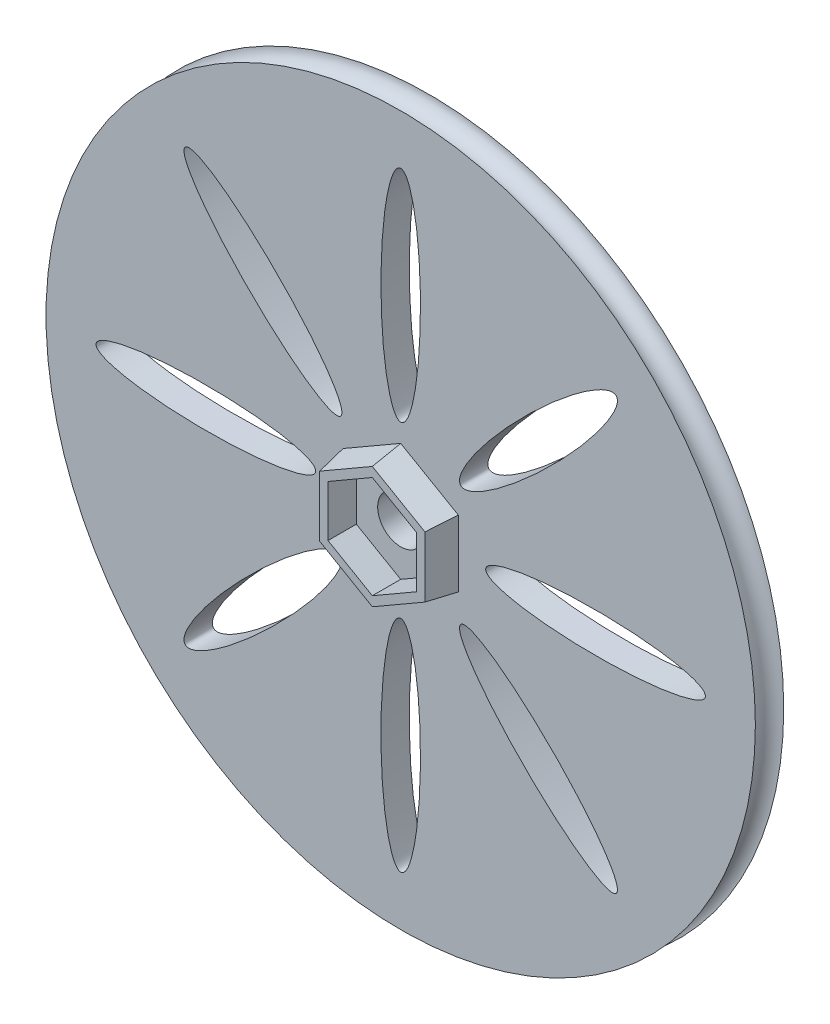
ISO-10303-21;
HEADER;
FILE_DESCRIPTION(('STEP AP214'),'2;1');
FILE_NAME('part.step','',(''),(''),'','','');
FILE_SCHEMA(('AUTOMOTIVE_DESIGN { 1 0 10303 214 1 1 1 1 }'));
ENDSEC;
DATA;
#1=APPLICATION_CONTEXT('core data for automotive mechanical design processes');
#2=APPLICATION_PROTOCOL_DEFINITION('international standard','automotive_design',2000,#1);
#3=PRODUCT_CONTEXT('',#1,'mechanical');
#4=PRODUCT('Part','Part','',(#3));
#5=PRODUCT_RELATED_PRODUCT_CATEGORY('part','',(#4));
#6=PRODUCT_DEFINITION_FORMATION('','',#4);
#7=PRODUCT_DEFINITION_CONTEXT('part definition',#1,'design');
#8=PRODUCT_DEFINITION('design','',#6,#7);
#9=PRODUCT_DEFINITION_SHAPE('','',#8);
#10=(LENGTH_UNIT() NAMED_UNIT(*) SI_UNIT(.MILLI.,.METRE.));
#11=(NAMED_UNIT(*) PLANE_ANGLE_UNIT() SI_UNIT($,.RADIAN.));
#12=(NAMED_UNIT(*) SI_UNIT($,.STERADIAN.) SOLID_ANGLE_UNIT());
#13=UNCERTAINTY_MEASURE_WITH_UNIT(LENGTH_MEASURE(1.E-05),#10,'distance_accuracy_value','');
#14=(GEOMETRIC_REPRESENTATION_CONTEXT(3) GLOBAL_UNCERTAINTY_ASSIGNED_CONTEXT((#13)) GLOBAL_UNIT_ASSIGNED_CONTEXT((#10,
#11,#12)) REPRESENTATION_CONTEXT('',''));
#15=CARTESIAN_POINT('',(0.,0.,0.));
#16=DIRECTION('',(0.,0.,1.));
#17=DIRECTION('',(1.,0.,0.));
#18=AXIS2_PLACEMENT_3D('',#15,#16,#17);
#19=CARTESIAN_POINT('',(0.,0.,2.032));
#20=DIRECTION('',(0.,0.,1.));
#21=DIRECTION('',(1.,0.,0.));
#22=AXIS2_PLACEMENT_3D('',#19,#20,#21);
#23=PLANE('',#22);
#24=CARTESIAN_POINT('',(-19.7328625352146,19.7328625352151,2.032));
#25=DIRECTION('',(0.,0.,1.));
#26=DIRECTION('',(0.707106781186539,-0.707106781186556,0.));
#27=AXIS2_PLACEMENT_3D('',#24,#25,#26);
#28=ELLIPSE('',#27,15.7362752755809,2.83617180564721);
#29=CARTESIAN_POINT('',(-8.60563557723324,8.60563557723345,2.032));
#30=VERTEX_POINT('',#29);
#31=EDGE_CURVE('E332',#30,#30,#28,.T.);
#32=ORIENTED_EDGE('',*,*,#31,.F.);
#33=EDGE_LOOP('',(#32));
#34=FACE_BOUND('',#33,.T.);
#35=CARTESIAN_POINT('',(-27.9064818217448,2.92304881540161E-13,2.032));
#36=DIRECTION('',(0.,0.,1.));
#37=DIRECTION('',(1.,0.,0.));
#38=AXIS2_PLACEMENT_3D('',#35,#36,#37);
#39=ELLIPSE('',#38,15.7362752755809,2.83617180564721);
#40=CARTESIAN_POINT('',(-12.1702065461638,1.27476147137393E-13,2.032));
#41=VERTEX_POINT('',#40);
#42=EDGE_CURVE('E400',#41,#41,#39,.T.);
#43=ORIENTED_EDGE('',*,*,#42,.F.);
#44=EDGE_LOOP('',(#43));
#45=FACE_BOUND('',#44,.T.);
#46=CARTESIAN_POINT('',(-19.732862535215,-19.7328625352147,2.032));
#47=DIRECTION('',(0.,0.,1.));
#48=DIRECTION('',(0.707106781186554,0.707106781186541,0.));
#49=AXIS2_PLACEMENT_3D('',#46,#47,#48);
#50=ELLIPSE('',#49,15.7362752755809,2.83617180564721);
#51=CARTESIAN_POINT('',(-8.60563557723342,-8.60563557723327,2.032));
#52=VERTEX_POINT('',#51);
#53=EDGE_CURVE('E392',#52,#52,#50,.T.);
#54=ORIENTED_EDGE('',*,*,#53,.F.);
#55=EDGE_LOOP('',(#54));
#56=FACE_BOUND('',#55,.T.);
#57=CARTESIAN_POINT('',(-1.94869921026774E-13,-27.9064818217448,2.032));
#58=DIRECTION('',(0.,0.,1.));
#59=DIRECTION('',(0.,1.,0.));
#60=AXIS2_PLACEMENT_3D('',#57,#58,#59);
#61=ELLIPSE('',#60,15.7362752755809,2.83617180564721);
#62=CARTESIAN_POINT('',(0.,-12.1702065461638,2.032));
#63=VERTEX_POINT('',#62);
#64=EDGE_CURVE('E384',#63,#63,#61,.T.);
#65=ORIENTED_EDGE('',*,*,#64,.F.);
#66=EDGE_LOOP('',(#65));
#67=FACE_BOUND('',#66,.T.);
#68=CARTESIAN_POINT('',(19.7328625352147,-19.7328625352149,2.032));
#69=DIRECTION('',(0.,0.,1.));
#70=DIRECTION('',(-0.707106781186544,0.707106781186551,0.));
#71=AXIS2_PLACEMENT_3D('',#68,#69,#70);
#72=ELLIPSE('',#71,15.7362752755809,2.83617180564722);
#73=CARTESIAN_POINT('',(8.6056355772333,-8.60563557723339,2.032));
#74=VERTEX_POINT('',#73);
#75=EDGE_CURVE('E376',#74,#74,#72,.T.);
#76=ORIENTED_EDGE('',*,*,#75,.F.);
#77=EDGE_LOOP('',(#76));
#78=FACE_BOUND('',#77,.T.);
#79=CARTESIAN_POINT('',(27.9064818217448,0.,2.032));
#80=DIRECTION('',(0.,0.,1.));
#81=DIRECTION('',(-1.,0.,0.));
#82=AXIS2_PLACEMENT_3D('',#79,#80,#81);
#83=ELLIPSE('',#82,15.7362752755809,2.83617180564721);
#84=CARTESIAN_POINT('',(12.1702065461638,0.,2.032));
#85=VERTEX_POINT('',#84);
#86=EDGE_CURVE('E368',#85,#85,#83,.T.);
#87=ORIENTED_EDGE('',*,*,#86,.F.);
#88=EDGE_LOOP('',(#87));
#89=FACE_BOUND('',#88,.T.);
#90=CARTESIAN_POINT('',(19.7328625352149,19.7328625352148,2.032));
#91=DIRECTION('',(0.,0.,1.));
#92=DIRECTION('',(-0.707106781186549,-0.707106781186546,0.));
#93=AXIS2_PLACEMENT_3D('',#90,#91,#92);
#94=ELLIPSE('',#93,15.736275275581,2.83617180564722);
#95=CARTESIAN_POINT('',(8.60563557723336,8.60563557723333,2.032));
#96=VERTEX_POINT('',#95);
#97=EDGE_CURVE('E360',#96,#96,#94,.T.);
#98=ORIENTED_EDGE('',*,*,#97,.F.);
#99=EDGE_LOOP('',(#98));
#100=FACE_BOUND('',#99,.T.);
#101=CARTESIAN_POINT('',(0.,27.9064818217448,2.032));
#102=DIRECTION('',(0.,0.,1.));
#103=DIRECTION('',(0.,-1.,0.));
#104=AXIS2_PLACEMENT_3D('',#101,#102,#103);
#105=ELLIPSE('',#104,15.7362752755809,2.83617180564721);
#106=CARTESIAN_POINT('',(0.,12.1702065461638,2.032));
#107=VERTEX_POINT('',#106);
#108=EDGE_CURVE('E331',#107,#107,#105,.T.);
#109=ORIENTED_EDGE('',*,*,#108,.F.);
#110=EDGE_LOOP('',(#109));
#111=FACE_BOUND('',#110,.T.);
#112=CARTESIAN_POINT('',(0.,0.,2.032));
#113=DIRECTION('',(0.,0.,1.));
#114=DIRECTION('',(1.,0.,0.));
#115=AXIS2_PLACEMENT_3D('',#112,#113,#114);
#116=CIRCLE('',#115,50.8);
#117=CARTESIAN_POINT('',(50.8,0.,2.032));
#118=VERTEX_POINT('',#117);
#119=EDGE_CURVE('E48',#118,#118,#116,.T.);
#120=ORIENTED_EDGE('',*,*,#119,.T.);
#121=EDGE_LOOP('',(#120));
#122=FACE_BOUND('',#121,.T.);
#123=DIRECTION('',(0.866025403784438,-0.5,0.));
#124=VECTOR('',#123,1.);
#125=CARTESIAN_POINT('',(-8.255,-4.76602647216036,2.032));
#126=LINE('',#125,#124);
#127=CARTESIAN_POINT('',(-8.255,-4.76602647216036,2.032));
#128=VERTEX_POINT('',#127);
#129=CARTESIAN_POINT('',(0.,-9.53205294432072,2.032));
#130=VERTEX_POINT('',#129);
#131=EDGE_CURVE('E192',#128,#130,#126,.T.);
#132=ORIENTED_EDGE('',*,*,#131,.F.);
#133=DIRECTION('',(0.,-1.,0.));
#134=VECTOR('',#133,1.);
#135=CARTESIAN_POINT('',(-8.255,4.76602647216036,2.032));
#136=LINE('',#135,#134);
#137=CARTESIAN_POINT('',(-8.255,4.76602647216036,2.032));
#138=VERTEX_POINT('',#137);
#139=EDGE_CURVE('E187',#138,#128,#136,.T.);
#140=ORIENTED_EDGE('',*,*,#139,.F.);
#141=DIRECTION('',(-0.866025403784439,-0.5,0.));
#142=VECTOR('',#141,1.);
#143=CARTESIAN_POINT('',(0.,9.53205294432072,2.032));
#144=LINE('',#143,#142);
#145=CARTESIAN_POINT('',(0.,9.53205294432072,2.032));
#146=VERTEX_POINT('',#145);
#147=EDGE_CURVE('E204',#146,#138,#144,.T.);
#148=ORIENTED_EDGE('',*,*,#147,.F.);
#149=DIRECTION('',(-0.866025403784439,0.5,0.));
#150=VECTOR('',#149,1.);
#151=CARTESIAN_POINT('',(8.255,4.76602647216036,2.032));
#152=LINE('',#151,#150);
#153=CARTESIAN_POINT('',(8.255,4.76602647216036,2.032));
#154=VERTEX_POINT('',#153);
#155=EDGE_CURVE('E201',#154,#146,#152,.T.);
#156=ORIENTED_EDGE('',*,*,#155,.F.);
#157=DIRECTION('',(0.,1.,0.));
#158=VECTOR('',#157,1.);
#159=CARTESIAN_POINT('',(8.255,-4.76602647216036,2.032));
#160=LINE('',#159,#158);
#161=CARTESIAN_POINT('',(8.255,-4.76602647216036,2.032));
#162=VERTEX_POINT('',#161);
#163=EDGE_CURVE('E198',#162,#154,#160,.T.);
#164=ORIENTED_EDGE('',*,*,#163,.F.);
#165=DIRECTION('',(0.866025403784439,0.5,0.));
#166=VECTOR('',#165,1.);
#167=CARTESIAN_POINT('',(0.,-9.53205294432072,2.032));
#168=LINE('',#167,#166);
#169=EDGE_CURVE('E195',#130,#162,#168,.T.);
#170=ORIENTED_EDGE('',*,*,#169,.F.);
#171=EDGE_LOOP('',(#132,#140,#148,#156,#164,#170));
#172=FACE_BOUND('',#171,.T.);
#173=ADVANCED_FACE('F39',(#34,#45,#56,#67,#78,#89,#100,#111,#122,#172),#23,.T.);
#174=CARTESIAN_POINT('',(0.,0.,0.));
#175=DIRECTION('',(0.,0.,1.));
#176=DIRECTION('',(1.,0.,0.));
#177=AXIS2_PLACEMENT_3D('',#174,#175,#176);
#178=TOROIDAL_SURFACE('',#177,50.8,2.032);
#179=CARTESIAN_POINT('',(0.,0.,-2.032));
#180=DIRECTION('',(0.,0.,1.));
#181=DIRECTION('',(1.,0.,0.));
#182=AXIS2_PLACEMENT_3D('',#179,#180,#181);
#183=CIRCLE('',#182,50.8);
#184=CARTESIAN_POINT('',(50.8,0.,-2.032));
#185=VERTEX_POINT('',#184);
#186=EDGE_CURVE('E11',#185,#185,#183,.T.);
#187=ORIENTED_EDGE('',*,*,#186,.T.);
#188=EDGE_LOOP('',(#187));
#189=FACE_BOUND('',#188,.T.);
#190=ORIENTED_EDGE('',*,*,#119,.F.);
#191=EDGE_LOOP('',(#190));
#192=FACE_BOUND('',#191,.T.);
#193=ADVANCED_FACE('F252',(#189,#192),#178,.F.);
#194=CARTESIAN_POINT('',(0.,0.,-2.032));
#195=DIRECTION('',(0.,0.,1.));
#196=DIRECTION('',(1.,0.,0.));
#197=AXIS2_PLACEMENT_3D('',#194,#195,#196);
#198=PLANE('',#197);
#199=CARTESIAN_POINT('',(-19.7328625352146,19.7328625352151,-2.032));
#200=DIRECTION('',(0.,0.,1.));
#201=DIRECTION('',(0.707106781186539,-0.707106781186556,0.));
#202=AXIS2_PLACEMENT_3D('',#199,#200,#201);
#203=ELLIPSE('',#202,15.7362752755809,2.83617180564721);
#204=CARTESIAN_POINT('',(-8.60563557723324,8.60563557723345,-2.032));
#205=VERTEX_POINT('',#204);
#206=EDGE_CURVE('E404',#205,#205,#203,.T.);
#207=ORIENTED_EDGE('',*,*,#206,.T.);
#208=EDGE_LOOP('',(#207));
#209=FACE_BOUND('',#208,.T.);
#210=CARTESIAN_POINT('',(-27.9064818217448,2.92304881540161E-13,-2.032));
#211=DIRECTION('',(0.,0.,1.));
#212=DIRECTION('',(1.,0.,0.));
#213=AXIS2_PLACEMENT_3D('',#210,#211,#212);
#214=ELLIPSE('',#213,15.7362752755809,2.83617180564721);
#215=CARTESIAN_POINT('',(-12.1702065461638,1.27476147137393E-13,-2.032));
#216=VERTEX_POINT('',#215);
#217=EDGE_CURVE('E396',#216,#216,#214,.T.);
#218=ORIENTED_EDGE('',*,*,#217,.T.);
#219=EDGE_LOOP('',(#218));
#220=FACE_BOUND('',#219,.T.);
#221=CARTESIAN_POINT('',(-19.732862535215,-19.7328625352147,-2.032));
#222=DIRECTION('',(0.,0.,1.));
#223=DIRECTION('',(0.707106781186554,0.707106781186541,0.));
#224=AXIS2_PLACEMENT_3D('',#221,#222,#223);
#225=ELLIPSE('',#224,15.7362752755809,2.83617180564721);
#226=CARTESIAN_POINT('',(-8.60563557723342,-8.60563557723327,-2.032));
#227=VERTEX_POINT('',#226);
#228=EDGE_CURVE('E388',#227,#227,#225,.T.);
#229=ORIENTED_EDGE('',*,*,#228,.T.);
#230=EDGE_LOOP('',(#229));
#231=FACE_BOUND('',#230,.T.);
#232=CARTESIAN_POINT('',(-1.94869921026774E-13,-27.9064818217448,-2.032));
#233=DIRECTION('',(0.,0.,1.));
#234=DIRECTION('',(0.,1.,0.));
#235=AXIS2_PLACEMENT_3D('',#232,#233,#234);
#236=ELLIPSE('',#235,15.7362752755809,2.83617180564721);
#237=CARTESIAN_POINT('',(0.,-12.1702065461638,-2.032));
#238=VERTEX_POINT('',#237);
#239=EDGE_CURVE('E380',#238,#238,#236,.T.);
#240=ORIENTED_EDGE('',*,*,#239,.T.);
#241=EDGE_LOOP('',(#240));
#242=FACE_BOUND('',#241,.T.);
#243=CARTESIAN_POINT('',(19.7328625352147,-19.7328625352149,-2.032));
#244=DIRECTION('',(0.,0.,1.));
#245=DIRECTION('',(-0.707106781186544,0.707106781186551,0.));
#246=AXIS2_PLACEMENT_3D('',#243,#244,#245);
#247=ELLIPSE('',#246,15.7362752755809,2.83617180564722);
#248=CARTESIAN_POINT('',(8.6056355772333,-8.60563557723339,-2.032));
#249=VERTEX_POINT('',#248);
#250=EDGE_CURVE('E372',#249,#249,#247,.T.);
#251=ORIENTED_EDGE('',*,*,#250,.T.);
#252=EDGE_LOOP('',(#251));
#253=FACE_BOUND('',#252,.T.);
#254=CARTESIAN_POINT('',(27.9064818217448,0.,-2.032));
#255=DIRECTION('',(0.,0.,1.));
#256=DIRECTION('',(-1.,0.,0.));
#257=AXIS2_PLACEMENT_3D('',#254,#255,#256);
#258=ELLIPSE('',#257,15.7362752755809,2.83617180564721);
#259=CARTESIAN_POINT('',(12.1702065461638,0.,-2.032));
#260=VERTEX_POINT('',#259);
#261=EDGE_CURVE('E364',#260,#260,#258,.T.);
#262=ORIENTED_EDGE('',*,*,#261,.T.);
#263=EDGE_LOOP('',(#262));
#264=FACE_BOUND('',#263,.T.);
#265=CARTESIAN_POINT('',(19.7328625352149,19.7328625352148,-2.032));
#266=DIRECTION('',(0.,0.,1.));
#267=DIRECTION('',(-0.707106781186549,-0.707106781186546,0.));
#268=AXIS2_PLACEMENT_3D('',#265,#266,#267);
#269=ELLIPSE('',#268,15.736275275581,2.83617180564722);
#270=CARTESIAN_POINT('',(8.60563557723336,8.60563557723333,-2.032));
#271=VERTEX_POINT('',#270);
#272=EDGE_CURVE('E336',#271,#271,#269,.T.);
#273=ORIENTED_EDGE('',*,*,#272,.T.);
#274=EDGE_LOOP('',(#273));
#275=FACE_BOUND('',#274,.T.);
#276=CARTESIAN_POINT('',(0.,27.9064818217448,-2.032));
#277=DIRECTION('',(0.,0.,1.));
#278=DIRECTION('',(0.,-1.,0.));
#279=AXIS2_PLACEMENT_3D('',#276,#277,#278);
#280=ELLIPSE('',#279,15.7362752755809,2.83617180564721);
#281=CARTESIAN_POINT('',(0.,12.1702065461638,-2.032));
#282=VERTEX_POINT('',#281);
#283=EDGE_CURVE('E324',#282,#282,#280,.T.);
#284=ORIENTED_EDGE('',*,*,#283,.T.);
#285=EDGE_LOOP('',(#284));
#286=FACE_BOUND('',#285,.T.);
#287=CARTESIAN_POINT('',(0.,0.,-2.032));
#288=DIRECTION('',(0.,0.,1.));
#289=DIRECTION('',(1.,0.,0.));
#290=AXIS2_PLACEMENT_3D('',#287,#288,#289);
#291=CIRCLE('',#290,3.302);
#292=CARTESIAN_POINT('',(3.302,0.,-2.032));
#293=VERTEX_POINT('',#292);
#294=EDGE_CURVE('E340',#293,#293,#291,.F.);
#295=ORIENTED_EDGE('',*,*,#294,.F.);
#296=EDGE_LOOP('',(#295));
#297=FACE_BOUND('',#296,.T.);
#298=ORIENTED_EDGE('',*,*,#186,.F.);
#299=EDGE_LOOP('',(#298));
#300=FACE_BOUND('',#299,.T.);
#301=ADVANCED_FACE('F41',(#209,#220,#231,#242,#253,#264,#275,#286,#297,#300),#198,.F.);
#302=CARTESIAN_POINT('',(-8.255,4.76602647216036,2.032));
#303=DIRECTION('',(-0.984807753012208,0.,0.173648177666931));
#304=DIRECTION('',(0.173648177666931,0.,0.984807753012208));
#305=AXIS2_PLACEMENT_3D('',#302,#303,#304);
#306=PLANE('',#305);
#307=ORIENTED_EDGE('',*,*,#139,.T.);
#308=DIRECTION('',(-0.172782012866211,-0.0997557416394319,-0.979895488325091));
#309=VECTOR('',#308,1.);
#310=CARTESIAN_POINT('',(-8.255,-4.76602647216036,2.032));
#311=LINE('',#310,#309);
#312=CARTESIAN_POINT('',(-7.5384071504008,-4.3523013975449,6.096));
#313=VERTEX_POINT('',#312);
#314=EDGE_CURVE('E208',#313,#128,#311,.T.);
#315=ORIENTED_EDGE('',*,*,#314,.F.);
#316=DIRECTION('',(0.,1.,0.));
#317=VECTOR('',#316,1.);
#318=CARTESIAN_POINT('',(-7.5384071504008,4.76602647216036,6.096));
#319=LINE('',#318,#317);
#320=CARTESIAN_POINT('',(-7.5384071504008,4.3523013975449,6.096));
#321=VERTEX_POINT('',#320);
#322=EDGE_CURVE('E207',#321,#313,#319,.F.);
#323=ORIENTED_EDGE('',*,*,#322,.F.);
#324=DIRECTION('',(-0.17278201286621,0.099755741639432,-0.97989548832509));
#325=VECTOR('',#324,1.);
#326=CARTESIAN_POINT('',(-8.255,4.76602647216036,2.032));
#327=LINE('',#326,#325);
#328=EDGE_CURVE('E212',#321,#138,#327,.T.);
#329=ORIENTED_EDGE('',*,*,#328,.T.);
#330=EDGE_LOOP('',(#307,#315,#323,#329));
#331=FACE_BOUND('',#330,.T.);
#332=ADVANCED_FACE('F260',(#331),#306,.T.);
#333=CARTESIAN_POINT('',(-8.255,-4.76602647216036,2.032));
#334=DIRECTION('',(-0.492403876506104,-0.852868531952443,0.173648177666931));
#335=DIRECTION('',(0.866025403784439,-0.5,0.));
#336=AXIS2_PLACEMENT_3D('',#333,#334,#335);
#337=PLANE('',#336);
#338=ORIENTED_EDGE('',*,*,#131,.T.);
#339=DIRECTION('',(0.,-0.199511483278864,-0.97989548832509));
#340=VECTOR('',#339,1.);
#341=CARTESIAN_POINT('',(0.,-9.53205294432072,2.032));
#342=LINE('',#341,#340);
#343=CARTESIAN_POINT('',(0.,-8.7046027950898,6.096));
#344=VERTEX_POINT('',#343);
#345=EDGE_CURVE('E211',#344,#130,#342,.T.);
#346=ORIENTED_EDGE('',*,*,#345,.F.);
#347=DIRECTION('',(-0.866025403784439,0.5,0.));
#348=VECTOR('',#347,1.);
#349=CARTESIAN_POINT('',(-7.8967035752004,-4.14543886023717,6.096));
#350=LINE('',#349,#348);
#351=EDGE_CURVE('E233',#313,#344,#350,.F.);
#352=ORIENTED_EDGE('',*,*,#351,.F.);
#353=ORIENTED_EDGE('',*,*,#314,.T.);
#354=EDGE_LOOP('',(#338,#346,#352,#353));
#355=FACE_BOUND('',#354,.T.);
#356=ADVANCED_FACE('F264',(#355),#337,.T.);
#357=CARTESIAN_POINT('',(0.,-9.53205294432072,2.032));
#358=DIRECTION('',(0.492403876506104,-0.852868531952443,0.173648177666931));
#359=DIRECTION('',(0.866025403784439,0.5,0.));
#360=AXIS2_PLACEMENT_3D('',#357,#358,#359);
#361=PLANE('',#360);
#362=ORIENTED_EDGE('',*,*,#169,.T.);
#363=DIRECTION('',(0.17278201286621,-0.099755741639432,-0.979895488325091));
#364=VECTOR('',#363,1.);
#365=CARTESIAN_POINT('',(8.255,-4.76602647216036,2.032));
#366=LINE('',#365,#364);
#367=CARTESIAN_POINT('',(7.53840715040079,-4.3523013975449,6.096));
#368=VERTEX_POINT('',#367);
#369=EDGE_CURVE('E223',#368,#162,#366,.T.);
#370=ORIENTED_EDGE('',*,*,#369,.F.);
#371=DIRECTION('',(-0.866025403784439,-0.5,0.));
#372=VECTOR('',#371,1.);
#373=CARTESIAN_POINT('',(-0.358296424799607,-8.91146533239753,6.096));
#374=LINE('',#373,#372);
#375=EDGE_CURVE('E236',#344,#368,#374,.F.);
#376=ORIENTED_EDGE('',*,*,#375,.F.);
#377=ORIENTED_EDGE('',*,*,#345,.T.);
#378=EDGE_LOOP('',(#362,#370,#376,#377));
#379=FACE_BOUND('',#378,.T.);
#380=ADVANCED_FACE('F267',(#379),#361,.T.);
#381=CARTESIAN_POINT('',(8.255,-4.76602647216036,2.032));
#382=DIRECTION('',(0.984807753012208,0.,0.173648177666931));
#383=DIRECTION('',(0.173648177666931,0.,-0.984807753012208));
#384=AXIS2_PLACEMENT_3D('',#381,#382,#383);
#385=PLANE('',#384);
#386=ORIENTED_EDGE('',*,*,#163,.T.);
#387=DIRECTION('',(0.172782012866211,0.099755741639432,-0.979895488325091));
#388=VECTOR('',#387,1.);
#389=CARTESIAN_POINT('',(8.255,4.76602647216036,2.032));
#390=LINE('',#389,#388);
#391=CARTESIAN_POINT('',(7.53840715040079,4.3523013975449,6.096));
#392=VERTEX_POINT('',#391);
#393=EDGE_CURVE('E219',#392,#154,#390,.T.);
#394=ORIENTED_EDGE('',*,*,#393,.F.);
#395=DIRECTION('',(0.,-1.,0.));
#396=VECTOR('',#395,1.);
#397=CARTESIAN_POINT('',(7.53840715040079,-4.76602647216036,6.096));
#398=LINE('',#397,#396);
#399=EDGE_CURVE('E239',#368,#392,#398,.F.);
#400=ORIENTED_EDGE('',*,*,#399,.F.);
#401=ORIENTED_EDGE('',*,*,#369,.T.);
#402=EDGE_LOOP('',(#386,#394,#400,#401));
#403=FACE_BOUND('',#402,.T.);
#404=ADVANCED_FACE('F271',(#403),#385,.T.);
#405=CARTESIAN_POINT('',(8.255,4.76602647216036,2.032));
#406=DIRECTION('',(0.492403876506104,0.852868531952443,0.173648177666931));
#407=DIRECTION('',(-0.866025403784439,0.5,0.));
#408=AXIS2_PLACEMENT_3D('',#405,#406,#407);
#409=PLANE('',#408);
#410=ORIENTED_EDGE('',*,*,#155,.T.);
#411=DIRECTION('',(0.,0.199511483278864,-0.979895488325091));
#412=VECTOR('',#411,1.);
#413=CARTESIAN_POINT('',(0.,9.53205294432072,2.032));
#414=LINE('',#413,#412);
#415=CARTESIAN_POINT('',(0.,8.7046027950898,6.096));
#416=VERTEX_POINT('',#415);
#417=EDGE_CURVE('E63',#416,#146,#414,.T.);
#418=ORIENTED_EDGE('',*,*,#417,.F.);
#419=DIRECTION('',(0.866025403784439,-0.5,0.));
#420=VECTOR('',#419,1.);
#421=CARTESIAN_POINT('',(7.8967035752004,4.14543886023717,6.096));
#422=LINE('',#421,#420);
#423=EDGE_CURVE('E242',#392,#416,#422,.F.);
#424=ORIENTED_EDGE('',*,*,#423,.F.);
#425=ORIENTED_EDGE('',*,*,#393,.T.);
#426=EDGE_LOOP('',(#410,#418,#424,#425));
#427=FACE_BOUND('',#426,.T.);
#428=ADVANCED_FACE('F275',(#427),#409,.T.);
#429=CARTESIAN_POINT('',(0.,9.53205294432072,2.032));
#430=DIRECTION('',(-0.492403876506104,0.852868531952443,0.173648177666931));
#431=DIRECTION('',(-0.866025403784439,-0.5,0.));
#432=AXIS2_PLACEMENT_3D('',#429,#430,#431);
#433=PLANE('',#432);
#434=ORIENTED_EDGE('',*,*,#147,.T.);
#435=ORIENTED_EDGE('',*,*,#328,.F.);
#436=DIRECTION('',(0.866025403784439,0.5,0.));
#437=VECTOR('',#436,1.);
#438=CARTESIAN_POINT('',(0.358296424799601,8.91146533239753,6.096));
#439=LINE('',#438,#437);
#440=EDGE_CURVE('E216',#416,#321,#439,.F.);
#441=ORIENTED_EDGE('',*,*,#440,.F.);
#442=ORIENTED_EDGE('',*,*,#417,.T.);
#443=EDGE_LOOP('',(#434,#435,#441,#442));
#444=FACE_BOUND('',#443,.T.);
#445=ADVANCED_FACE('F279',(#444),#433,.T.);
#446=CARTESIAN_POINT('',(0.,0.,6.096));
#447=DIRECTION('',(0.,0.,1.));
#448=DIRECTION('',(1.,0.,0.));
#449=AXIS2_PLACEMENT_3D('',#446,#447,#448);
#450=PLANE('',#449);
#451=DIRECTION('',(0.866025403784438,-0.5,0.));
#452=VECTOR('',#451,1.);
#453=CARTESIAN_POINT('',(-6.35,-3.66617420935412,6.096));
#454=LINE('',#453,#452);
#455=CARTESIAN_POINT('',(-6.35,-3.66617420935412,6.096));
#456=VERTEX_POINT('',#455);
#457=CARTESIAN_POINT('',(0.,-7.33234841870825,6.096));
#458=VERTEX_POINT('',#457);
#459=EDGE_CURVE('E55',#456,#458,#454,.T.);
#460=ORIENTED_EDGE('',*,*,#459,.F.);
#461=DIRECTION('',(0.,-1.,0.));
#462=VECTOR('',#461,1.);
#463=CARTESIAN_POINT('',(-6.35,3.66617420935412,6.096));
#464=LINE('',#463,#462);
#465=CARTESIAN_POINT('',(-6.35,3.66617420935412,6.096));
#466=VERTEX_POINT('',#465);
#467=EDGE_CURVE('E167',#466,#456,#464,.T.);
#468=ORIENTED_EDGE('',*,*,#467,.F.);
#469=DIRECTION('',(-0.866025403784439,-0.5,0.));
#470=VECTOR('',#469,1.);
#471=CARTESIAN_POINT('',(0.,7.33234841870825,6.096));
#472=LINE('',#471,#470);
#473=CARTESIAN_POINT('',(0.,7.33234841870825,6.096));
#474=VERTEX_POINT('',#473);
#475=EDGE_CURVE('E160',#474,#466,#472,.T.);
#476=ORIENTED_EDGE('',*,*,#475,.F.);
#477=DIRECTION('',(-0.866025403784439,0.5,0.));
#478=VECTOR('',#477,1.);
#479=CARTESIAN_POINT('',(6.35,3.66617420935413,6.096));
#480=LINE('',#479,#478);
#481=CARTESIAN_POINT('',(6.35,3.66617420935413,6.096));
#482=VERTEX_POINT('',#481);
#483=EDGE_CURVE('E156',#482,#474,#480,.T.);
#484=ORIENTED_EDGE('',*,*,#483,.F.);
#485=DIRECTION('',(0.,1.,0.));
#486=VECTOR('',#485,1.);
#487=CARTESIAN_POINT('',(6.35,-3.66617420935412,6.096));
#488=LINE('',#487,#486);
#489=CARTESIAN_POINT('',(6.35,-3.66617420935412,6.096));
#490=VERTEX_POINT('',#489);
#491=EDGE_CURVE('E136',#490,#482,#488,.T.);
#492=ORIENTED_EDGE('',*,*,#491,.F.);
#493=DIRECTION('',(0.866025403784438,0.5,0.));
#494=VECTOR('',#493,1.);
#495=CARTESIAN_POINT('',(0.,-7.33234841870825,6.096));
#496=LINE('',#495,#494);
#497=EDGE_CURVE('E147',#458,#490,#496,.T.);
#498=ORIENTED_EDGE('',*,*,#497,.F.);
#499=EDGE_LOOP('',(#460,#468,#476,#484,#492,#498));
#500=FACE_BOUND('',#499,.T.);
#501=ORIENTED_EDGE('',*,*,#322,.T.);
#502=ORIENTED_EDGE('',*,*,#351,.T.);
#503=ORIENTED_EDGE('',*,*,#375,.T.);
#504=ORIENTED_EDGE('',*,*,#399,.T.);
#505=ORIENTED_EDGE('',*,*,#423,.T.);
#506=ORIENTED_EDGE('',*,*,#440,.T.);
#507=EDGE_LOOP('',(#501,#502,#503,#504,#505,#506));
#508=FACE_BOUND('',#507,.T.);
#509=ADVANCED_FACE('F152',(#500,#508),#450,.T.);
#510=CARTESIAN_POINT('',(-6.35,-3.66617420935412,-17.3675704419797));
#511=DIRECTION('',(-0.5,-0.866025403784439,0.));
#512=DIRECTION('',(0.866025403784439,-0.5,0.));
#513=AXIS2_PLACEMENT_3D('',#510,#511,#512);
#514=PLANE('',#513);
#515=DIRECTION('',(-0.866025403784439,0.5,0.));
#516=VECTOR('',#515,1.);
#517=CARTESIAN_POINT('',(-6.35,-3.66617420935412,2.032));
#518=LINE('',#517,#516);
#519=CARTESIAN_POINT('',(0.,-7.33234841870825,2.032));
#520=VERTEX_POINT('',#519);
#521=CARTESIAN_POINT('',(-6.35,-3.66617420935412,2.032));
#522=VERTEX_POINT('',#521);
#523=EDGE_CURVE('E188',#520,#522,#518,.T.);
#524=ORIENTED_EDGE('',*,*,#523,.T.);
#525=DIRECTION('',(0.,0.,1.));
#526=VECTOR('',#525,1.);
#527=CARTESIAN_POINT('',(-6.35,-3.66617420935412,-17.3675704419797));
#528=LINE('',#527,#526);
#529=EDGE_CURVE('E171',#522,#456,#528,.T.);
#530=ORIENTED_EDGE('',*,*,#529,.T.);
#531=ORIENTED_EDGE('',*,*,#459,.T.);
#532=DIRECTION('',(0.,0.,1.));
#533=VECTOR('',#532,1.);
#534=CARTESIAN_POINT('',(0.,-7.33234841870825,-17.3675704419797));
#535=LINE('',#534,#533);
#536=EDGE_CURVE('E144',#520,#458,#535,.T.);
#537=ORIENTED_EDGE('',*,*,#536,.F.);
#538=EDGE_LOOP('',(#524,#530,#531,#537));
#539=FACE_BOUND('',#538,.T.);
#540=ADVANCED_FACE('F288',(#539),#514,.F.);
#541=CARTESIAN_POINT('',(-6.35,3.66617420935412,-17.3675704419797));
#542=DIRECTION('',(-1.,0.,0.));
#543=DIRECTION('',(0.,0.,1.));
#544=AXIS2_PLACEMENT_3D('',#541,#542,#543);
#545=PLANE('',#544);
#546=DIRECTION('',(0.,1.,0.));
#547=VECTOR('',#546,1.);
#548=CARTESIAN_POINT('',(-6.35,3.66617420935412,2.032));
#549=LINE('',#548,#547);
#550=CARTESIAN_POINT('',(-6.35,3.66617420935412,2.032));
#551=VERTEX_POINT('',#550);
#552=EDGE_CURVE('E352',#522,#551,#549,.T.);
#553=ORIENTED_EDGE('',*,*,#552,.T.);
#554=DIRECTION('',(0.,0.,1.));
#555=VECTOR('',#554,1.);
#556=CARTESIAN_POINT('',(-6.35,3.66617420935412,-17.3675704419797));
#557=LINE('',#556,#555);
#558=EDGE_CURVE('E174',#551,#466,#557,.T.);
#559=ORIENTED_EDGE('',*,*,#558,.T.);
#560=ORIENTED_EDGE('',*,*,#467,.T.);
#561=ORIENTED_EDGE('',*,*,#529,.F.);
#562=EDGE_LOOP('',(#553,#559,#560,#561));
#563=FACE_BOUND('',#562,.T.);
#564=ADVANCED_FACE('F291',(#563),#545,.F.);
#565=CARTESIAN_POINT('',(0.,7.33234841870825,-17.3675704419797));
#566=DIRECTION('',(-0.5,0.866025403784438,0.));
#567=DIRECTION('',(-0.866025403784439,-0.5,0.));
#568=AXIS2_PLACEMENT_3D('',#565,#566,#567);
#569=PLANE('',#568);
#570=DIRECTION('',(0.866025403784439,0.5,0.));
#571=VECTOR('',#570,1.);
#572=CARTESIAN_POINT('',(0.,7.33234841870825,2.032));
#573=LINE('',#572,#571);
#574=CARTESIAN_POINT('',(0.,7.33234841870825,2.032));
#575=VERTEX_POINT('',#574);
#576=EDGE_CURVE('E349',#551,#575,#573,.T.);
#577=ORIENTED_EDGE('',*,*,#576,.T.);
#578=DIRECTION('',(0.,0.,1.));
#579=VECTOR('',#578,1.);
#580=CARTESIAN_POINT('',(0.,7.33234841870825,-17.3675704419797));
#581=LINE('',#580,#579);
#582=EDGE_CURVE('E177',#575,#474,#581,.T.);
#583=ORIENTED_EDGE('',*,*,#582,.T.);
#584=ORIENTED_EDGE('',*,*,#475,.T.);
#585=ORIENTED_EDGE('',*,*,#558,.F.);
#586=EDGE_LOOP('',(#577,#583,#584,#585));
#587=FACE_BOUND('',#586,.T.);
#588=ADVANCED_FACE('F300',(#587),#569,.F.);
#589=CARTESIAN_POINT('',(6.35,3.66617420935413,-17.3675704419797));
#590=DIRECTION('',(0.5,0.866025403784439,0.));
#591=DIRECTION('',(-0.866025403784439,0.5,0.));
#592=AXIS2_PLACEMENT_3D('',#589,#590,#591);
#593=PLANE('',#592);
#594=DIRECTION('',(0.866025403784439,-0.5,0.));
#595=VECTOR('',#594,1.);
#596=CARTESIAN_POINT('',(6.35,3.66617420935413,2.032));
#597=LINE('',#596,#595);
#598=CARTESIAN_POINT('',(6.35,3.66617420935413,2.032));
#599=VERTEX_POINT('',#598);
#600=EDGE_CURVE('E346',#575,#599,#597,.T.);
#601=ORIENTED_EDGE('',*,*,#600,.T.);
#602=DIRECTION('',(0.,0.,1.));
#603=VECTOR('',#602,1.);
#604=CARTESIAN_POINT('',(6.35,3.66617420935413,-17.3675704419797));
#605=LINE('',#604,#603);
#606=EDGE_CURVE('E143',#599,#482,#605,.T.);
#607=ORIENTED_EDGE('',*,*,#606,.T.);
#608=ORIENTED_EDGE('',*,*,#483,.T.);
#609=ORIENTED_EDGE('',*,*,#582,.F.);
#610=EDGE_LOOP('',(#601,#607,#608,#609));
#611=FACE_BOUND('',#610,.T.);
#612=ADVANCED_FACE('F297',(#611),#593,.F.);
#613=CARTESIAN_POINT('',(6.35,-3.66617420935412,-17.3675704419797));
#614=DIRECTION('',(1.,0.,0.));
#615=DIRECTION('',(0.,1.,0.));
#616=AXIS2_PLACEMENT_3D('',#613,#614,#615);
#617=PLANE('',#616);
#618=DIRECTION('',(0.,-1.,0.));
#619=VECTOR('',#618,1.);
#620=CARTESIAN_POINT('',(6.35,-3.66617420935412,2.032));
#621=LINE('',#620,#619);
#622=CARTESIAN_POINT('',(6.35,-3.66617420935412,2.03199999999999));
#623=VERTEX_POINT('',#622);
#624=EDGE_CURVE('E139',#599,#623,#621,.T.);
#625=ORIENTED_EDGE('',*,*,#624,.T.);
#626=DIRECTION('',(0.,0.,1.));
#627=VECTOR('',#626,1.);
#628=CARTESIAN_POINT('',(6.35,-3.66617420935412,-17.3675704419797));
#629=LINE('',#628,#627);
#630=EDGE_CURVE('E131',#623,#490,#629,.T.);
#631=ORIENTED_EDGE('',*,*,#630,.T.);
#632=ORIENTED_EDGE('',*,*,#491,.T.);
#633=ORIENTED_EDGE('',*,*,#606,.F.);
#634=EDGE_LOOP('',(#625,#631,#632,#633));
#635=FACE_BOUND('',#634,.T.);
#636=ADVANCED_FACE('F133',(#635),#617,.F.);
#637=CARTESIAN_POINT('',(0.,-7.33234841870825,-17.3675704419797));
#638=DIRECTION('',(0.5,-0.866025403784438,0.));
#639=DIRECTION('',(0.866025403784439,0.5,0.));
#640=AXIS2_PLACEMENT_3D('',#637,#638,#639);
#641=PLANE('',#640);
#642=DIRECTION('',(-0.866025403784439,-0.5,0.));
#643=VECTOR('',#642,1.);
#644=CARTESIAN_POINT('',(0.,-7.33234841870825,2.032));
#645=LINE('',#644,#643);
#646=EDGE_CURVE('E184',#623,#520,#645,.T.);
#647=ORIENTED_EDGE('',*,*,#646,.T.);
#648=ORIENTED_EDGE('',*,*,#536,.T.);
#649=ORIENTED_EDGE('',*,*,#497,.T.);
#650=ORIENTED_EDGE('',*,*,#630,.F.);
#651=EDGE_LOOP('',(#647,#648,#649,#650));
#652=FACE_BOUND('',#651,.T.);
#653=ADVANCED_FACE('F148',(#652),#641,.F.);
#654=CARTESIAN_POINT('',(0.,0.,2.032));
#655=DIRECTION('',(0.,0.,1.));
#656=DIRECTION('',(1.,0.,0.));
#657=AXIS2_PLACEMENT_3D('',#654,#655,#656);
#658=PLANE('',#657);
#659=CARTESIAN_POINT('',(0.,0.,2.032));
#660=DIRECTION('',(0.,0.,1.));
#661=DIRECTION('',(1.,0.,0.));
#662=AXIS2_PLACEMENT_3D('',#659,#660,#661);
#663=CIRCLE('',#662,3.302);
#664=CARTESIAN_POINT('',(3.302,0.,2.032));
#665=VERTEX_POINT('',#664);
#666=EDGE_CURVE('E330',#665,#665,#663,.T.);
#667=ORIENTED_EDGE('',*,*,#666,.F.);
#668=EDGE_LOOP('',(#667));
#669=FACE_BOUND('',#668,.T.);
#670=ORIENTED_EDGE('',*,*,#523,.F.);
#671=ORIENTED_EDGE('',*,*,#646,.F.);
#672=ORIENTED_EDGE('',*,*,#624,.F.);
#673=ORIENTED_EDGE('',*,*,#600,.F.);
#674=ORIENTED_EDGE('',*,*,#576,.F.);
#675=ORIENTED_EDGE('',*,*,#552,.F.);
#676=EDGE_LOOP('',(#670,#671,#672,#673,#674,#675));
#677=FACE_BOUND('',#676,.T.);
#678=ADVANCED_FACE('F294',(#669,#677),#658,.T.);
#679=CARTESIAN_POINT('',(0.,0.,-2.033));
#680=DIRECTION('',(0.,0.,1.));
#681=DIRECTION('',(1.,0.,0.));
#682=AXIS2_PLACEMENT_3D('',#679,#680,#681);
#683=CYLINDRICAL_SURFACE('',#682,3.302);
#684=ORIENTED_EDGE('',*,*,#666,.T.);
#685=EDGE_LOOP('',(#684));
#686=FACE_BOUND('',#685,.T.);
#687=ORIENTED_EDGE('',*,*,#294,.T.);
#688=EDGE_LOOP('',(#687));
#689=FACE_BOUND('',#688,.T.);
#690=ADVANCED_FACE('F310',(#686,#689),#683,.F.);
#691=DIRECTION('',(0.,0.,1.));
#692=VECTOR('',#691,1.);
#693=SURFACE_OF_LINEAR_EXTRUSION('',#280,#692);
#694=ORIENTED_EDGE('',*,*,#283,.F.);
#695=EDGE_LOOP('',(#694));
#696=FACE_BOUND('',#695,.T.);
#697=ORIENTED_EDGE('',*,*,#108,.T.);
#698=EDGE_LOOP('',(#697));
#699=FACE_BOUND('',#698,.T.);
#700=ADVANCED_FACE('F314',(#696,#699),#693,.F.);
#701=DIRECTION('',(0.,0.,1.));
#702=VECTOR('',#701,1.);
#703=SURFACE_OF_LINEAR_EXTRUSION('',#269,#702);
#704=ORIENTED_EDGE('',*,*,#272,.F.);
#705=EDGE_LOOP('',(#704));
#706=FACE_BOUND('',#705,.T.);
#707=ORIENTED_EDGE('',*,*,#97,.T.);
#708=EDGE_LOOP('',(#707));
#709=FACE_BOUND('',#708,.T.);
#710=ADVANCED_FACE('F319',(#706,#709),#703,.F.);
#711=DIRECTION('',(0.,0.,1.));
#712=VECTOR('',#711,1.);
#713=SURFACE_OF_LINEAR_EXTRUSION('',#258,#712);
#714=ORIENTED_EDGE('',*,*,#261,.F.);
#715=EDGE_LOOP('',(#714));
#716=FACE_BOUND('',#715,.T.);
#717=ORIENTED_EDGE('',*,*,#86,.T.);
#718=EDGE_LOOP('',(#717));
#719=FACE_BOUND('',#718,.T.);
#720=ADVANCED_FACE('F428',(#716,#719),#713,.F.);
#721=DIRECTION('',(0.,0.,1.));
#722=VECTOR('',#721,1.);
#723=SURFACE_OF_LINEAR_EXTRUSION('',#247,#722);
#724=ORIENTED_EDGE('',*,*,#250,.F.);
#725=EDGE_LOOP('',(#724));
#726=FACE_BOUND('',#725,.T.);
#727=ORIENTED_EDGE('',*,*,#75,.T.);
#728=EDGE_LOOP('',(#727));
#729=FACE_BOUND('',#728,.T.);
#730=ADVANCED_FACE('F434',(#726,#729),#723,.F.);
#731=DIRECTION('',(0.,0.,1.));
#732=VECTOR('',#731,1.);
#733=SURFACE_OF_LINEAR_EXTRUSION('',#236,#732);
#734=ORIENTED_EDGE('',*,*,#239,.F.);
#735=EDGE_LOOP('',(#734));
#736=FACE_BOUND('',#735,.T.);
#737=ORIENTED_EDGE('',*,*,#64,.T.);
#738=EDGE_LOOP('',(#737));
#739=FACE_BOUND('',#738,.T.);
#740=ADVANCED_FACE('F444',(#736,#739),#733,.F.);
#741=DIRECTION('',(0.,0.,1.));
#742=VECTOR('',#741,1.);
#743=SURFACE_OF_LINEAR_EXTRUSION('',#225,#742);
#744=ORIENTED_EDGE('',*,*,#228,.F.);
#745=EDGE_LOOP('',(#744));
#746=FACE_BOUND('',#745,.T.);
#747=ORIENTED_EDGE('',*,*,#53,.T.);
#748=EDGE_LOOP('',(#747));
#749=FACE_BOUND('',#748,.T.);
#750=ADVANCED_FACE('F448',(#746,#749),#743,.F.);
#751=DIRECTION('',(0.,0.,1.));
#752=VECTOR('',#751,1.);
#753=SURFACE_OF_LINEAR_EXTRUSION('',#214,#752);
#754=ORIENTED_EDGE('',*,*,#217,.F.);
#755=EDGE_LOOP('',(#754));
#756=FACE_BOUND('',#755,.T.);
#757=ORIENTED_EDGE('',*,*,#42,.T.);
#758=EDGE_LOOP('',(#757));
#759=FACE_BOUND('',#758,.T.);
#760=ADVANCED_FACE('F453',(#756,#759),#753,.F.);
#761=DIRECTION('',(0.,0.,1.));
#762=VECTOR('',#761,1.);
#763=SURFACE_OF_LINEAR_EXTRUSION('',#203,#762);
#764=ORIENTED_EDGE('',*,*,#206,.F.);
#765=EDGE_LOOP('',(#764));
#766=FACE_BOUND('',#765,.T.);
#767=ORIENTED_EDGE('',*,*,#31,.T.);
#768=EDGE_LOOP('',(#767));
#769=FACE_BOUND('',#768,.T.);
#770=ADVANCED_FACE('F321',(#766,#769),#763,.F.);
#771=CLOSED_SHELL('',(#173,#193,#301,#332,#356,#380,#404,#428,#445,#509,#540,#564,#588,#612,
#636,#653,#678,#690,#700,#710,#720,#730,#740,#750,#760,#770));
#772=MANIFOLD_SOLID_BREP('B2',#771);
#773=ADVANCED_BREP_SHAPE_REPRESENTATION('',(#18,#772),#14);
#774=SHAPE_DEFINITION_REPRESENTATION(#9,#773);
ENDSEC;
END-ISO-10303-21;
